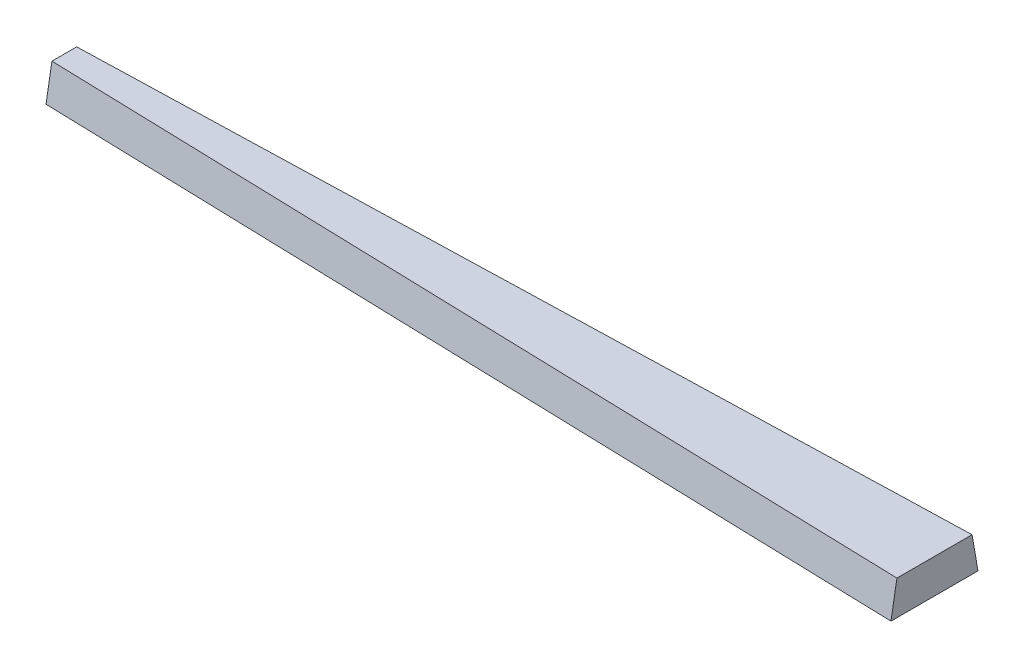
ISO-10303-21;
HEADER;
FILE_DESCRIPTION(('STEP AP214'),'2;1');
FILE_NAME('part.step','',(''),(''),'','','');
FILE_SCHEMA(('AUTOMOTIVE_DESIGN { 1 0 10303 214 1 1 1 1 }'));
ENDSEC;
DATA;
#1=APPLICATION_CONTEXT('core data for automotive mechanical design processes');
#2=APPLICATION_PROTOCOL_DEFINITION('international standard','automotive_design',2000,#1);
#3=PRODUCT_CONTEXT('',#1,'mechanical');
#4=PRODUCT('Part','Part','',(#3));
#5=PRODUCT_RELATED_PRODUCT_CATEGORY('part','',(#4));
#6=PRODUCT_DEFINITION_FORMATION('','',#4);
#7=PRODUCT_DEFINITION_CONTEXT('part definition',#1,'design');
#8=PRODUCT_DEFINITION('design','',#6,#7);
#9=PRODUCT_DEFINITION_SHAPE('','',#8);
#10=(LENGTH_UNIT() NAMED_UNIT(*) SI_UNIT(.MILLI.,.METRE.));
#11=(NAMED_UNIT(*) PLANE_ANGLE_UNIT() SI_UNIT($,.RADIAN.));
#12=(NAMED_UNIT(*) SI_UNIT($,.STERADIAN.) SOLID_ANGLE_UNIT());
#13=UNCERTAINTY_MEASURE_WITH_UNIT(LENGTH_MEASURE(1.E-05),#10,'distance_accuracy_value','');
#14=(GEOMETRIC_REPRESENTATION_CONTEXT(3) GLOBAL_UNCERTAINTY_ASSIGNED_CONTEXT((#13)) GLOBAL_UNIT_ASSIGNED_CONTEXT((#10,
#11,#12)) REPRESENTATION_CONTEXT('',''));
#15=CARTESIAN_POINT('',(0.,0.,0.));
#16=DIRECTION('',(0.,0.,1.));
#17=DIRECTION('',(1.,0.,0.));
#18=AXIS2_PLACEMENT_3D('',#15,#16,#17);
#19=CARTESIAN_POINT('',(241.3,19.05,25.4));
#20=DIRECTION('',(-1.,0.,0.));
#21=DIRECTION('',(0.,0.,1.));
#22=AXIS2_PLACEMENT_3D('',#19,#20,#21);
#23=PLANE('',#22);
#24=DIRECTION('',(0.,-0.985407898483489,-0.170209499166036));
#25=VECTOR('',#24,1.);
#26=CARTESIAN_POINT('',(241.3,26.8055553626642,-19.4998766164061));
#27=LINE('',#26,#25);
#28=CARTESIAN_POINT('',(241.3,19.05,-20.8394936380122));
#29=VERTEX_POINT('',#28);
#30=CARTESIAN_POINT('',(241.3,0.,-24.13));
#31=VERTEX_POINT('',#30);
#32=EDGE_CURVE('E47',#29,#31,#27,.T.);
#33=ORIENTED_EDGE('',*,*,#32,.F.);
#34=DIRECTION('',(0.,0.,-1.));
#35=VECTOR('',#34,1.);
#36=CARTESIAN_POINT('',(241.3,19.05,25.4));
#37=LINE('',#36,#35);
#38=CARTESIAN_POINT('',(241.3,19.05,20.8394936380122));
#39=VERTEX_POINT('',#38);
#40=EDGE_CURVE('E83',#39,#29,#37,.T.);
#41=ORIENTED_EDGE('',*,*,#40,.F.);
#42=DIRECTION('',(0.,0.985407898483489,-0.170209499166036));
#43=VECTOR('',#42,1.);
#44=CARTESIAN_POINT('',(241.3,18.2850854910076,20.9716173156088));
#45=LINE('',#44,#43);
#46=CARTESIAN_POINT('',(241.3,0.,24.13));
#47=VERTEX_POINT('',#46);
#48=EDGE_CURVE('E96',#47,#39,#45,.T.);
#49=ORIENTED_EDGE('',*,*,#48,.F.);
#50=DIRECTION('',(0.,0.,-1.));
#51=VECTOR('',#50,1.);
#52=CARTESIAN_POINT('',(241.3,0.,25.4));
#53=LINE('',#52,#51);
#54=EDGE_CURVE('E84',#47,#31,#53,.T.);
#55=ORIENTED_EDGE('',*,*,#54,.T.);
#56=EDGE_LOOP('',(#33,#41,#49,#55));
#57=FACE_BOUND('',#56,.T.);
#58=ADVANCED_FACE('F33',(#57),#23,.F.);
#59=CARTESIAN_POINT('',(-241.3,19.05,25.4));
#60=DIRECTION('',(1.,0.,0.));
#61=DIRECTION('',(0.,0.,-1.));
#62=AXIS2_PLACEMENT_3D('',#59,#60,#61);
#63=PLANE('',#62);
#64=DIRECTION('',(0.,0.985407898483489,0.170209499166036));
#65=VECTOR('',#64,1.);
#66=CARTESIAN_POINT('',(-241.3,24.4624261479586,-5.93460530868685));
#67=LINE('',#66,#65);
#68=CARTESIAN_POINT('',(-241.3,0.,-10.16));
#69=VERTEX_POINT('',#68);
#70=CARTESIAN_POINT('',(-241.3,19.05,-6.86949363801217));
#71=VERTEX_POINT('',#70);
#72=EDGE_CURVE('E72',#69,#71,#67,.T.);
#73=ORIENTED_EDGE('',*,*,#72,.F.);
#74=DIRECTION('',(0.,0.,1.));
#75=VECTOR('',#74,1.);
#76=CARTESIAN_POINT('',(-241.3,0.,25.4));
#77=LINE('',#76,#75);
#78=CARTESIAN_POINT('',(-241.3,0.,10.16));
#79=VERTEX_POINT('',#78);
#80=EDGE_CURVE('E54',#69,#79,#77,.T.);
#81=ORIENTED_EDGE('',*,*,#80,.T.);
#82=DIRECTION('',(0.,-0.985407898483489,0.170209499166036));
#83=VECTOR('',#82,1.);
#84=CARTESIAN_POINT('',(-241.3,15.941956276302,7.40634600788958));
#85=LINE('',#84,#83);
#86=CARTESIAN_POINT('',(-241.3,19.05,6.86949363801216));
#87=VERTEX_POINT('',#86);
#88=EDGE_CURVE('E98',#87,#79,#85,.T.);
#89=ORIENTED_EDGE('',*,*,#88,.F.);
#90=DIRECTION('',(0.,0.,1.));
#91=VECTOR('',#90,1.);
#92=CARTESIAN_POINT('',(-241.3,19.05,25.4));
#93=LINE('',#92,#91);
#94=EDGE_CURVE('E79',#71,#87,#93,.T.);
#95=ORIENTED_EDGE('',*,*,#94,.F.);
#96=EDGE_LOOP('',(#73,#81,#89,#95));
#97=FACE_BOUND('',#96,.T.);
#98=ADVANCED_FACE('F78',(#97),#63,.F.);
#99=CARTESIAN_POINT('',(0.,19.05,0.));
#100=DIRECTION('',(0.,-1.,0.));
#101=DIRECTION('',(0.,0.,-1.));
#102=AXIS2_PLACEMENT_3D('',#99,#100,#101);
#103=PLANE('',#102);
#104=DIRECTION('',(0.999581288057178,0.,-0.0289352478121815));
#105=VECTOR('',#104,1.);
#106=CARTESIAN_POINT('',(-0.40071535214184,19.05,-13.8428939830817));
#107=LINE('',#106,#105);
#108=EDGE_CURVE('E100',#71,#29,#107,.T.);
#109=ORIENTED_EDGE('',*,*,#108,.F.);
#110=ORIENTED_EDGE('',*,*,#94,.T.);
#111=DIRECTION('',(-0.999581288057178,0.,-0.0289352478121815));
#112=VECTOR('',#111,1.);
#113=CARTESIAN_POINT('',(-0.40071535214184,19.05,13.8428939830817));
#114=LINE('',#113,#112);
#115=EDGE_CURVE('E88',#39,#87,#114,.T.);
#116=ORIENTED_EDGE('',*,*,#115,.F.);
#117=ORIENTED_EDGE('',*,*,#40,.T.);
#118=EDGE_LOOP('',(#109,#110,#116,#117));
#119=FACE_BOUND('',#118,.T.);
#120=ADVANCED_FACE('F105',(#119),#103,.F.);
#121=CARTESIAN_POINT('',(0.,0.,0.));
#122=DIRECTION('',(0.,-1.,0.));
#123=DIRECTION('',(0.,0.,-1.));
#124=AXIS2_PLACEMENT_3D('',#121,#122,#123);
#125=PLANE('',#124);
#126=ORIENTED_EDGE('',*,*,#80,.F.);
#127=DIRECTION('',(0.999581288057178,0.,-0.0289352478121815));
#128=VECTOR('',#127,1.);
#129=CARTESIAN_POINT('',(-0.49588710291238,0.,-17.1306453733368));
#130=LINE('',#129,#128);
#131=EDGE_CURVE('E11',#69,#31,#130,.T.);
#132=ORIENTED_EDGE('',*,*,#131,.T.);
#133=ORIENTED_EDGE('',*,*,#54,.F.);
#134=DIRECTION('',(-0.999581288057178,0.,-0.0289352478121815));
#135=VECTOR('',#134,1.);
#136=CARTESIAN_POINT('',(-0.49588710291238,0.,17.1306453733368));
#137=LINE('',#136,#135);
#138=EDGE_CURVE('E40',#47,#79,#137,.T.);
#139=ORIENTED_EDGE('',*,*,#138,.T.);
#140=EDGE_LOOP('',(#126,#132,#133,#139));
#141=FACE_BOUND('',#140,.T.);
#142=ADVANCED_FACE('F82',(#141),#125,.T.);
#143=CARTESIAN_POINT('',(-0.481532302099299,2.87332063637771,16.6347522543394));
#144=DIRECTION('',(-0.0285133675531618,0.170140293903331,0.985007242745588));
#145=DIRECTION('',(0.,-0.98540789848349,0.170209499166036));
#146=AXIS2_PLACEMENT_3D('',#143,#144,#145);
#147=PLANE('',#146);
#148=ORIENTED_EDGE('',*,*,#115,.T.);
#149=ORIENTED_EDGE('',*,*,#88,.T.);
#150=ORIENTED_EDGE('',*,*,#138,.F.);
#151=ORIENTED_EDGE('',*,*,#48,.T.);
#152=EDGE_LOOP('',(#148,#149,#150,#151));
#153=FACE_BOUND('',#152,.T.);
#154=ADVANCED_FACE('F107',(#153),#147,.T.);
#155=CARTESIAN_POINT('',(-0.481532302099299,2.87332063637771,-16.6347522543394));
#156=DIRECTION('',(-0.0285133675531618,0.170140293903331,-0.985007242745588));
#157=DIRECTION('',(0.,-0.98540789848349,-0.170209499166036));
#158=AXIS2_PLACEMENT_3D('',#155,#156,#157);
#159=PLANE('',#158);
#160=ORIENTED_EDGE('',*,*,#108,.T.);
#161=ORIENTED_EDGE('',*,*,#32,.T.);
#162=ORIENTED_EDGE('',*,*,#131,.F.);
#163=ORIENTED_EDGE('',*,*,#72,.T.);
#164=EDGE_LOOP('',(#160,#161,#162,#163));
#165=FACE_BOUND('',#164,.T.);
#166=ADVANCED_FACE('F71',(#165),#159,.T.);
#167=CLOSED_SHELL('',(#58,#98,#120,#142,#154,#166));
#168=MANIFOLD_SOLID_BREP('B2',#167);
#169=ADVANCED_BREP_SHAPE_REPRESENTATION('',(#18,#168),#14);
#170=SHAPE_DEFINITION_REPRESENTATION(#9,#169);
ENDSEC;
END-ISO-10303-21;
